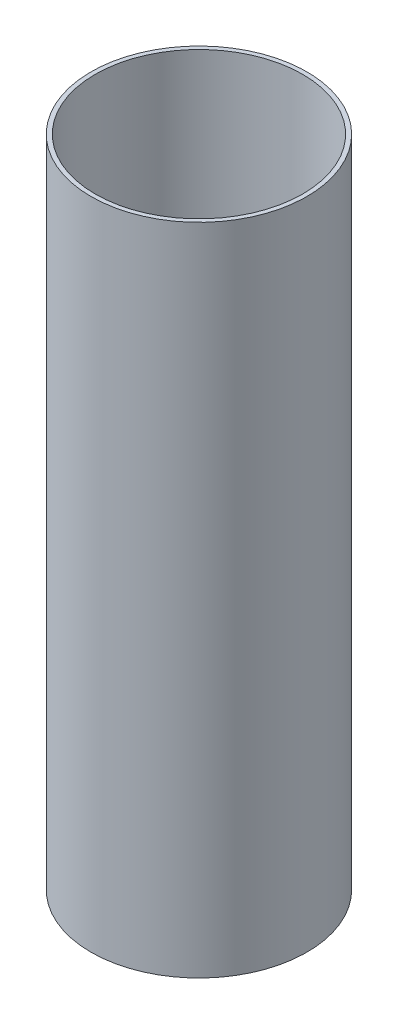
ISO-10303-21;
HEADER;
FILE_DESCRIPTION(('STEP AP214'),'2;1');
FILE_NAME('part.step','',(''),(''),'','','');
FILE_SCHEMA(('AUTOMOTIVE_DESIGN { 1 0 10303 214 1 1 1 1 }'));
ENDSEC;
DATA;
#1=APPLICATION_CONTEXT('core data for automotive mechanical design processes');
#2=APPLICATION_PROTOCOL_DEFINITION('international standard','automotive_design',2000,#1);
#3=PRODUCT_CONTEXT('',#1,'mechanical');
#4=PRODUCT('Part','Part','',(#3));
#5=PRODUCT_RELATED_PRODUCT_CATEGORY('part','',(#4));
#6=PRODUCT_DEFINITION_FORMATION('','',#4);
#7=PRODUCT_DEFINITION_CONTEXT('part definition',#1,'design');
#8=PRODUCT_DEFINITION('design','',#6,#7);
#9=PRODUCT_DEFINITION_SHAPE('','',#8);
#10=(LENGTH_UNIT() NAMED_UNIT(*) SI_UNIT(.MILLI.,.METRE.));
#11=(NAMED_UNIT(*) PLANE_ANGLE_UNIT() SI_UNIT($,.RADIAN.));
#12=(NAMED_UNIT(*) SI_UNIT($,.STERADIAN.) SOLID_ANGLE_UNIT());
#13=UNCERTAINTY_MEASURE_WITH_UNIT(LENGTH_MEASURE(1.E-05),#10,'distance_accuracy_value','');
#14=(GEOMETRIC_REPRESENTATION_CONTEXT(3) GLOBAL_UNCERTAINTY_ASSIGNED_CONTEXT((#13)) GLOBAL_UNIT_ASSIGNED_CONTEXT((#10,
#11,#12)) REPRESENTATION_CONTEXT('',''));
#15=CARTESIAN_POINT('',(0.,0.,0.));
#16=DIRECTION('',(0.,0.,1.));
#17=DIRECTION('',(1.,0.,0.));
#18=AXIS2_PLACEMENT_3D('',#15,#16,#17);
#19=CARTESIAN_POINT('',(0.,230.,0.));
#20=DIRECTION('',(0.,1.,0.));
#21=DIRECTION('',(0.,0.,1.));
#22=AXIS2_PLACEMENT_3D('',#19,#20,#21);
#23=PLANE('',#22);
#24=CARTESIAN_POINT('',(0.,230.,0.));
#25=DIRECTION('',(0.,1.,0.));
#26=DIRECTION('',(0.,0.,1.));
#27=AXIS2_PLACEMENT_3D('',#24,#25,#26);
#28=CIRCLE('',#27,37.95);
#29=CARTESIAN_POINT('',(0.,230.,37.95));
#30=VERTEX_POINT('',#29);
#31=EDGE_CURVE('E10',#30,#30,#28,.T.);
#32=ORIENTED_EDGE('',*,*,#31,.T.);
#33=EDGE_LOOP('',(#32));
#34=FACE_BOUND('',#33,.T.);
#35=CARTESIAN_POINT('',(0.,230.,0.));
#36=DIRECTION('',(0.,1.,0.));
#37=DIRECTION('',(0.,0.,1.));
#38=AXIS2_PLACEMENT_3D('',#35,#36,#37);
#39=CIRCLE('',#38,36.45);
#40=CARTESIAN_POINT('',(0.,230.,36.45));
#41=VERTEX_POINT('',#40);
#42=EDGE_CURVE('E45',#41,#41,#39,.T.);
#43=ORIENTED_EDGE('',*,*,#42,.F.);
#44=EDGE_LOOP('',(#43));
#45=FACE_BOUND('',#44,.T.);
#46=ADVANCED_FACE('F34',(#34,#45),#23,.T.);
#47=CARTESIAN_POINT('',(0.,0.,0.));
#48=DIRECTION('',(0.,1.,0.));
#49=DIRECTION('',(0.,0.,1.));
#50=AXIS2_PLACEMENT_3D('',#47,#48,#49);
#51=PLANE('',#50);
#52=CARTESIAN_POINT('',(0.,0.,0.));
#53=DIRECTION('',(0.,1.,0.));
#54=DIRECTION('',(0.,0.,1.));
#55=AXIS2_PLACEMENT_3D('',#52,#53,#54);
#56=CIRCLE('',#55,37.95);
#57=CARTESIAN_POINT('',(0.,0.,37.95));
#58=VERTEX_POINT('',#57);
#59=EDGE_CURVE('E38',#58,#58,#56,.T.);
#60=ORIENTED_EDGE('',*,*,#59,.F.);
#61=EDGE_LOOP('',(#60));
#62=FACE_BOUND('',#61,.T.);
#63=CARTESIAN_POINT('',(0.,0.,0.));
#64=DIRECTION('',(0.,1.,0.));
#65=DIRECTION('',(0.,0.,1.));
#66=AXIS2_PLACEMENT_3D('',#63,#64,#65);
#67=CIRCLE('',#66,36.45);
#68=CARTESIAN_POINT('',(0.,0.,36.45));
#69=VERTEX_POINT('',#68);
#70=EDGE_CURVE('E47',#69,#69,#67,.T.);
#71=ORIENTED_EDGE('',*,*,#70,.T.);
#72=EDGE_LOOP('',(#71));
#73=FACE_BOUND('',#72,.T.);
#74=ADVANCED_FACE('F57',(#62,#73),#51,.F.);
#75=CARTESIAN_POINT('',(0.,230.,0.));
#76=DIRECTION('',(0.,-1.,0.));
#77=DIRECTION('',(0.,0.,-1.));
#78=AXIS2_PLACEMENT_3D('',#75,#76,#77);
#79=CYLINDRICAL_SURFACE('',#78,37.95);
#80=ORIENTED_EDGE('',*,*,#31,.F.);
#81=EDGE_LOOP('',(#80));
#82=FACE_BOUND('',#81,.T.);
#83=ORIENTED_EDGE('',*,*,#59,.T.);
#84=EDGE_LOOP('',(#83));
#85=FACE_BOUND('',#84,.T.);
#86=ADVANCED_FACE('F36',(#82,#85),#79,.T.);
#87=CARTESIAN_POINT('',(0.,230.,0.));
#88=DIRECTION('',(0.,-1.,0.));
#89=DIRECTION('',(0.,0.,-1.));
#90=AXIS2_PLACEMENT_3D('',#87,#88,#89);
#91=CYLINDRICAL_SURFACE('',#90,36.45);
#92=ORIENTED_EDGE('',*,*,#42,.T.);
#93=EDGE_LOOP('',(#92));
#94=FACE_BOUND('',#93,.T.);
#95=ORIENTED_EDGE('',*,*,#70,.F.);
#96=EDGE_LOOP('',(#95));
#97=FACE_BOUND('',#96,.T.);
#98=ADVANCED_FACE('F53',(#94,#97),#91,.F.);
#99=CLOSED_SHELL('',(#46,#74,#86,#98));
#100=MANIFOLD_SOLID_BREP('B2',#99);
#101=ADVANCED_BREP_SHAPE_REPRESENTATION('',(#18,#100),#14);
#102=SHAPE_DEFINITION_REPRESENTATION(#9,#101);
ENDSEC;
END-ISO-10303-21;
